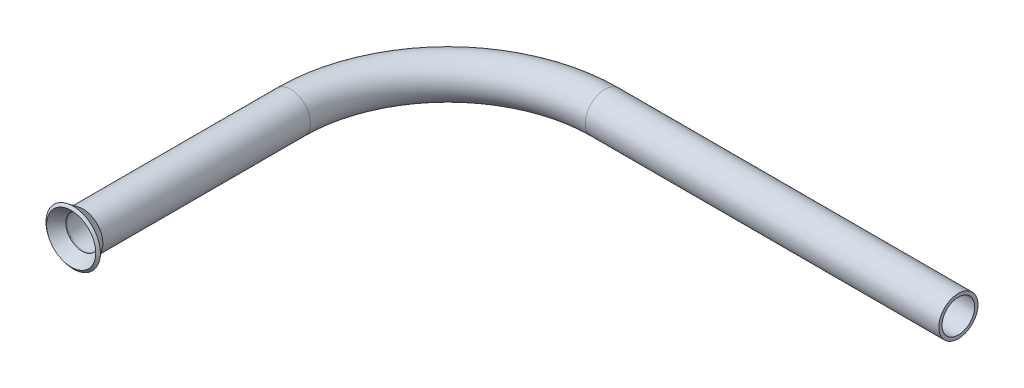
ISO-10303-21;
HEADER;
FILE_DESCRIPTION(('STEP AP214'),'2;1');
FILE_NAME('part.step','',(''),(''),'','','');
FILE_SCHEMA(('AUTOMOTIVE_DESIGN { 1 0 10303 214 1 1 1 1 }'));
ENDSEC;
DATA;
#1=APPLICATION_CONTEXT('core data for automotive mechanical design processes');
#2=APPLICATION_PROTOCOL_DEFINITION('international standard','automotive_design',2000,#1);
#3=PRODUCT_CONTEXT('',#1,'mechanical');
#4=PRODUCT('Part','Part','',(#3));
#5=PRODUCT_RELATED_PRODUCT_CATEGORY('part','',(#4));
#6=PRODUCT_DEFINITION_FORMATION('','',#4);
#7=PRODUCT_DEFINITION_CONTEXT('part definition',#1,'design');
#8=PRODUCT_DEFINITION('design','',#6,#7);
#9=PRODUCT_DEFINITION_SHAPE('','',#8);
#10=(LENGTH_UNIT() NAMED_UNIT(*) SI_UNIT(.MILLI.,.METRE.));
#11=(NAMED_UNIT(*) PLANE_ANGLE_UNIT() SI_UNIT($,.RADIAN.));
#12=(NAMED_UNIT(*) SI_UNIT($,.STERADIAN.) SOLID_ANGLE_UNIT());
#13=UNCERTAINTY_MEASURE_WITH_UNIT(LENGTH_MEASURE(1.E-05),#10,'distance_accuracy_value','');
#14=(GEOMETRIC_REPRESENTATION_CONTEXT(3) GLOBAL_UNCERTAINTY_ASSIGNED_CONTEXT((#13)) GLOBAL_UNIT_ASSIGNED_CONTEXT((#10,
#11,#12)) REPRESENTATION_CONTEXT('',''));
#15=CARTESIAN_POINT('',(0.,0.,0.));
#16=DIRECTION('',(0.,0.,1.));
#17=DIRECTION('',(1.,0.,0.));
#18=AXIS2_PLACEMENT_3D('',#15,#16,#17);
#19=CARTESIAN_POINT('',(0.,0.,-67.1078639050389));
#20=DIRECTION('',(0.,0.,1.));
#21=DIRECTION('',(1.,0.,0.));
#22=AXIS2_PLACEMENT_3D('',#19,#20,#21);
#23=CYLINDRICAL_SURFACE('',#22,5.2832);
#24=CARTESIAN_POINT('',(0.,0.,0.));
#25=DIRECTION('',(0.,0.,-1.));
#26=DIRECTION('',(-1.,0.,0.));
#27=AXIS2_PLACEMENT_3D('',#24,#25,#26);
#28=CIRCLE('',#27,5.2832);
#29=CARTESIAN_POINT('',(-5.2832,0.,0.));
#30=VERTEX_POINT('',#29);
#31=EDGE_CURVE('E54',#30,#30,#28,.T.);
#32=ORIENTED_EDGE('',*,*,#31,.F.);
#33=EDGE_LOOP('',(#32));
#34=FACE_BOUND('',#33,.T.);
#35=CARTESIAN_POINT('',(0.,0.,-67.1078639050389));
#36=DIRECTION('',(0.,0.,1.));
#37=DIRECTION('',(1.,0.,0.));
#38=AXIS2_PLACEMENT_3D('',#35,#36,#37);
#39=CIRCLE('',#38,5.2832);
#40=CARTESIAN_POINT('',(-5.28319999999999,0.,-67.1078639050389));
#41=VERTEX_POINT('',#40);
#42=EDGE_CURVE('E65',#41,#41,#39,.T.);
#43=ORIENTED_EDGE('',*,*,#42,.F.);
#44=EDGE_LOOP('',(#43));
#45=FACE_BOUND('',#44,.T.);
#46=ADVANCED_FACE('F47',(#34,#45),#23,.F.);
#47=CARTESIAN_POINT('',(0.,0.,-67.1078639050389));
#48=DIRECTION('',(0.,0.,1.));
#49=DIRECTION('',(1.,0.,0.));
#50=AXIS2_PLACEMENT_3D('',#47,#48,#49);
#51=CYLINDRICAL_SURFACE('',#50,6.35);
#52=CARTESIAN_POINT('',(0.,0.,0.));
#53=DIRECTION('',(0.,0.,-1.));
#54=DIRECTION('',(-1.,0.,0.));
#55=AXIS2_PLACEMENT_3D('',#52,#53,#54);
#56=CIRCLE('',#55,6.35);
#57=CARTESIAN_POINT('',(-6.35,0.,0.));
#58=VERTEX_POINT('',#57);
#59=EDGE_CURVE('E58',#58,#58,#56,.T.);
#60=ORIENTED_EDGE('',*,*,#59,.T.);
#61=EDGE_LOOP('',(#60));
#62=FACE_BOUND('',#61,.T.);
#63=CARTESIAN_POINT('',(0.,0.,-67.1078639050389));
#64=DIRECTION('',(0.,0.,-1.));
#65=DIRECTION('',(-1.,0.,0.));
#66=AXIS2_PLACEMENT_3D('',#63,#64,#65);
#67=CIRCLE('',#66,6.35);
#68=CARTESIAN_POINT('',(-6.34999999999999,0.,-67.1078639050389));
#69=VERTEX_POINT('',#68);
#70=EDGE_CURVE('E12',#69,#69,#67,.T.);
#71=ORIENTED_EDGE('',*,*,#70,.F.);
#72=EDGE_LOOP('',(#71));
#73=FACE_BOUND('',#72,.T.);
#74=ADVANCED_FACE('F49',(#62,#73),#51,.T.);
#75=CARTESIAN_POINT('',(0.,0.,0.));
#76=DIRECTION('',(0.,0.,-1.));
#77=DIRECTION('',(-1.,0.,0.));
#78=AXIS2_PLACEMENT_3D('',#75,#76,#77);
#79=PLANE('',#78);
#80=ORIENTED_EDGE('',*,*,#31,.T.);
#81=EDGE_LOOP('',(#80));
#82=FACE_BOUND('',#81,.T.);
#83=ORIENTED_EDGE('',*,*,#59,.F.);
#84=EDGE_LOOP('',(#83));
#85=FACE_BOUND('',#84,.T.);
#86=ADVANCED_FACE('F99',(#82,#85),#79,.F.);
#87=CARTESIAN_POINT('',(50.8,0.,-67.1078639050389));
#88=DIRECTION('',(0.,1.,0.));
#89=DIRECTION('',(0.,0.,1.));
#90=AXIS2_PLACEMENT_3D('',#87,#88,#89);
#91=TOROIDAL_SURFACE('',#90,50.8,5.2832);
#92=CARTESIAN_POINT('',(50.8,0.,-117.907863905039));
#93=DIRECTION('',(-1.,0.,0.));
#94=DIRECTION('',(0.,0.,1.));
#95=AXIS2_PLACEMENT_3D('',#92,#93,#94);
#96=CIRCLE('',#95,5.2832);
#97=CARTESIAN_POINT('',(50.8,0.,-123.191063905039));
#98=VERTEX_POINT('',#97);
#99=EDGE_CURVE('E71',#98,#98,#96,.T.);
#100=CARTESIAN_POINT('',(50.8,0.,-67.1078639050389));
#101=DIRECTION('',(0.,1.,0.));
#102=DIRECTION('',(0.,0.,1.));
#103=AXIS2_PLACEMENT_3D('',#100,#101,#102);
#104=CIRCLE('',#103,56.0832);
#105=EDGE_CURVE('',#98,#41,#104,.T.);
#106=ORIENTED_EDGE('',*,*,#99,.F.);
#107=ORIENTED_EDGE('',*,*,#42,.T.);
#108=ORIENTED_EDGE('',*,*,#105,.T.);
#109=ORIENTED_EDGE('',*,*,#105,.F.);
#110=EDGE_LOOP('',(#106,#108,#107,#109));
#111=FACE_BOUND('',#110,.T.);
#112=ADVANCED_FACE('F91',(#111),#91,.F.);
#113=CARTESIAN_POINT('',(50.8,0.,-67.1078639050389));
#114=DIRECTION('',(0.,1.,0.));
#115=DIRECTION('',(0.,0.,1.));
#116=AXIS2_PLACEMENT_3D('',#113,#114,#115);
#117=TOROIDAL_SURFACE('',#116,50.8,6.35);
#118=CARTESIAN_POINT('',(50.8,0.,-117.907863905039));
#119=DIRECTION('',(1.,0.,0.));
#120=DIRECTION('',(0.,0.,-1.));
#121=AXIS2_PLACEMENT_3D('',#118,#119,#120);
#122=CIRCLE('',#121,6.35);
#123=CARTESIAN_POINT('',(50.8,0.,-124.257863905039));
#124=VERTEX_POINT('',#123);
#125=EDGE_CURVE('E62',#124,#124,#122,.T.);
#126=CARTESIAN_POINT('',(50.8,0.,-67.1078639050389));
#127=DIRECTION('',(0.,1.,0.));
#128=DIRECTION('',(0.,0.,1.));
#129=AXIS2_PLACEMENT_3D('',#126,#127,#128);
#130=CIRCLE('',#129,57.15);
#131=EDGE_CURVE('',#124,#69,#130,.T.);
#132=ORIENTED_EDGE('',*,*,#125,.F.);
#133=ORIENTED_EDGE('',*,*,#70,.T.);
#134=ORIENTED_EDGE('',*,*,#131,.T.);
#135=ORIENTED_EDGE('',*,*,#131,.F.);
#136=EDGE_LOOP('',(#132,#134,#133,#135));
#137=FACE_BOUND('',#136,.T.);
#138=ADVANCED_FACE('F89',(#137),#117,.T.);
#139=CARTESIAN_POINT('',(165.107049194447,0.,-117.907863905039));
#140=DIRECTION('',(-1.,0.,0.));
#141=DIRECTION('',(0.,0.,1.));
#142=AXIS2_PLACEMENT_3D('',#139,#140,#141);
#143=CYLINDRICAL_SURFACE('',#142,5.2832);
#144=CARTESIAN_POINT('',(165.107049194447,0.,-117.907863905039));
#145=DIRECTION('',(1.,0.,0.));
#146=DIRECTION('',(0.,0.,-1.));
#147=AXIS2_PLACEMENT_3D('',#144,#145,#146);
#148=CIRCLE('',#147,5.2832);
#149=CARTESIAN_POINT('',(165.107049194447,0.,-123.191063905039));
#150=VERTEX_POINT('',#149);
#151=EDGE_CURVE('E74',#150,#150,#148,.T.);
#152=ORIENTED_EDGE('',*,*,#151,.T.);
#153=EDGE_LOOP('',(#152));
#154=FACE_BOUND('',#153,.T.);
#155=ORIENTED_EDGE('',*,*,#99,.T.);
#156=EDGE_LOOP('',(#155));
#157=FACE_BOUND('',#156,.T.);
#158=ADVANCED_FACE('F85',(#154,#157),#143,.F.);
#159=CARTESIAN_POINT('',(165.107049194447,0.,-117.907863905039));
#160=DIRECTION('',(-1.,0.,0.));
#161=DIRECTION('',(0.,0.,1.));
#162=AXIS2_PLACEMENT_3D('',#159,#160,#161);
#163=CYLINDRICAL_SURFACE('',#162,6.35);
#164=CARTESIAN_POINT('',(165.107049194447,0.,-117.907863905039));
#165=DIRECTION('',(1.,0.,0.));
#166=DIRECTION('',(0.,0.,-1.));
#167=AXIS2_PLACEMENT_3D('',#164,#165,#166);
#168=CIRCLE('',#167,6.35);
#169=CARTESIAN_POINT('',(165.107049194447,0.,-124.257863905039));
#170=VERTEX_POINT('',#169);
#171=EDGE_CURVE('E68',#170,#170,#168,.T.);
#172=ORIENTED_EDGE('',*,*,#171,.F.);
#173=EDGE_LOOP('',(#172));
#174=FACE_BOUND('',#173,.T.);
#175=ORIENTED_EDGE('',*,*,#125,.T.);
#176=EDGE_LOOP('',(#175));
#177=FACE_BOUND('',#176,.T.);
#178=ADVANCED_FACE('F82',(#174,#177),#163,.T.);
#179=CARTESIAN_POINT('',(165.107049194447,0.,-117.907863905039));
#180=DIRECTION('',(1.,0.,0.));
#181=DIRECTION('',(0.,0.,-1.));
#182=AXIS2_PLACEMENT_3D('',#179,#180,#181);
#183=PLANE('',#182);
#184=ORIENTED_EDGE('',*,*,#151,.F.);
#185=EDGE_LOOP('',(#184));
#186=FACE_BOUND('',#185,.T.);
#187=ORIENTED_EDGE('',*,*,#171,.T.);
#188=EDGE_LOOP('',(#187));
#189=FACE_BOUND('',#188,.T.);
#190=ADVANCED_FACE('F80',(#186,#189),#183,.T.);
#191=CLOSED_SHELL('',(#46,#74,#86,#112,#138,#158,#178,#190));
#192=MANIFOLD_SOLID_BREP('B2',#191);
#193=CARTESIAN_POINT('',(0.,5.2832,0.));
#194=DIRECTION('',(0.,0.,1.));
#195=DIRECTION('',(0.,-1.,0.));
#196=AXIS2_PLACEMENT_3D('',#193,#194,#195);
#197=PLANE('',#196);
#198=CARTESIAN_POINT('',(0.,0.,0.));
#199=DIRECTION('',(0.,0.,1.));
#200=DIRECTION('',(0.,-1.,0.));
#201=AXIS2_PLACEMENT_3D('',#198,#199,#200);
#202=CIRCLE('',#201,6.35);
#203=CARTESIAN_POINT('',(0.,-6.35,0.));
#204=VERTEX_POINT('',#203);
#205=EDGE_CURVE('E204',#204,#204,#202,.T.);
#206=ORIENTED_EDGE('',*,*,#205,.F.);
#207=EDGE_LOOP('',(#206));
#208=FACE_BOUND('',#207,.T.);
#209=CARTESIAN_POINT('',(0.,0.,0.));
#210=DIRECTION('',(0.,0.,1.));
#211=DIRECTION('',(0.,-1.,0.));
#212=AXIS2_PLACEMENT_3D('',#209,#210,#211);
#213=CIRCLE('',#212,5.2832);
#214=CARTESIAN_POINT('',(0.,-5.2832,0.));
#215=VERTEX_POINT('',#214);
#216=EDGE_CURVE('E46',#215,#215,#213,.T.);
#217=ORIENTED_EDGE('',*,*,#216,.T.);
#218=EDGE_LOOP('',(#217));
#219=FACE_BOUND('',#218,.T.);
#220=ADVANCED_FACE('F185',(#208,#219),#197,.F.);
#221=CARTESIAN_POINT('',(0.,0.,0.));
#222=DIRECTION('',(0.,0.,1.));
#223=DIRECTION('',(0.,-1.,0.));
#224=AXIS2_PLACEMENT_3D('',#221,#222,#223);
#225=CYLINDRICAL_SURFACE('',#224,5.2832);
#226=ORIENTED_EDGE('',*,*,#216,.F.);
#227=EDGE_LOOP('',(#226));
#228=FACE_BOUND('',#227,.T.);
#229=CARTESIAN_POINT('',(0.,0.,0.356946286844812));
#230=DIRECTION('',(0.,0.,1.));
#231=DIRECTION('',(0.,-1.,0.));
#232=AXIS2_PLACEMENT_3D('',#229,#230,#231);
#233=CIRCLE('',#232,5.2832);
#234=CARTESIAN_POINT('',(0.,-5.2832,0.356946286844812));
#235=VERTEX_POINT('',#234);
#236=EDGE_CURVE('E191',#235,#235,#233,.T.);
#237=ORIENTED_EDGE('',*,*,#236,.T.);
#238=EDGE_LOOP('',(#237));
#239=FACE_BOUND('',#238,.T.);
#240=ADVANCED_FACE('F211',(#228,#239),#225,.F.);
#241=CARTESIAN_POINT('',(0.,0.,3.8876709795308));
#242=DIRECTION('',(0.,0.,1.));
#243=DIRECTION('',(0.,-1.,0.));
#244=AXIS2_PLACEMENT_3D('',#241,#242,#243);
#245=CONICAL_SURFACE('',#244,7.94379189197148,0.645771823237903);
#246=ORIENTED_EDGE('',*,*,#236,.F.);
#247=EDGE_LOOP('',(#246));
#248=FACE_BOUND('',#247,.T.);
#249=CARTESIAN_POINT('',(0.,0.,3.8876709795308));
#250=DIRECTION('',(0.,0.,1.));
#251=DIRECTION('',(0.,-1.,0.));
#252=AXIS2_PLACEMENT_3D('',#249,#250,#251);
#253=CIRCLE('',#252,7.94379189197148);
#254=CARTESIAN_POINT('',(0.,-7.94379189197148,3.8876709795308));
#255=VERTEX_POINT('',#254);
#256=EDGE_CURVE('E195',#255,#255,#253,.T.);
#257=ORIENTED_EDGE('',*,*,#256,.T.);
#258=EDGE_LOOP('',(#257));
#259=FACE_BOUND('',#258,.T.);
#260=ADVANCED_FACE('F215',(#248,#259),#245,.F.);
#261=CARTESIAN_POINT('',(0.,0.,3.24565471283219));
#262=DIRECTION('',(0.,0.,-1.));
#263=DIRECTION('',(0.,1.,0.));
#264=AXIS2_PLACEMENT_3D('',#261,#262,#263);
#265=CONICAL_SURFACE('',#264,8.79577625408993,0.925024503556994);
#266=ORIENTED_EDGE('',*,*,#256,.F.);
#267=EDGE_LOOP('',(#266));
#268=FACE_BOUND('',#267,.T.);
#269=CARTESIAN_POINT('',(0.,0.,3.24565471283219));
#270=DIRECTION('',(0.,0.,1.));
#271=DIRECTION('',(0.,-1.,0.));
#272=AXIS2_PLACEMENT_3D('',#269,#270,#271);
#273=CIRCLE('',#272,8.79577625408993);
#274=CARTESIAN_POINT('',(0.,-8.79577625408993,3.24565471283219));
#275=VERTEX_POINT('',#274);
#276=EDGE_CURVE('E199',#275,#275,#273,.T.);
#277=ORIENTED_EDGE('',*,*,#276,.T.);
#278=EDGE_LOOP('',(#277));
#279=FACE_BOUND('',#278,.T.);
#280=ADVANCED_FACE('F220',(#268,#279),#265,.T.);
#281=CARTESIAN_POINT('',(0.,0.,0.));
#282=DIRECTION('',(0.,0.,1.));
#283=DIRECTION('',(0.,-1.,0.));
#284=AXIS2_PLACEMENT_3D('',#281,#282,#283);
#285=CONICAL_SURFACE('',#284,6.35,0.645771823237903);
#286=ORIENTED_EDGE('',*,*,#276,.F.);
#287=EDGE_LOOP('',(#286));
#288=FACE_BOUND('',#287,.T.);
#289=ORIENTED_EDGE('',*,*,#205,.T.);
#290=EDGE_LOOP('',(#289));
#291=FACE_BOUND('',#290,.T.);
#292=ADVANCED_FACE('F208',(#288,#291),#285,.T.);
#293=CLOSED_SHELL('',(#220,#240,#260,#280,#292));
#294=MANIFOLD_SOLID_BREP('B7',#293);
#295=ADVANCED_BREP_SHAPE_REPRESENTATION('',(#18,#192,#294),#14);
#296=SHAPE_DEFINITION_REPRESENTATION(#9,#295);
ENDSEC;
END-ISO-10303-21;
